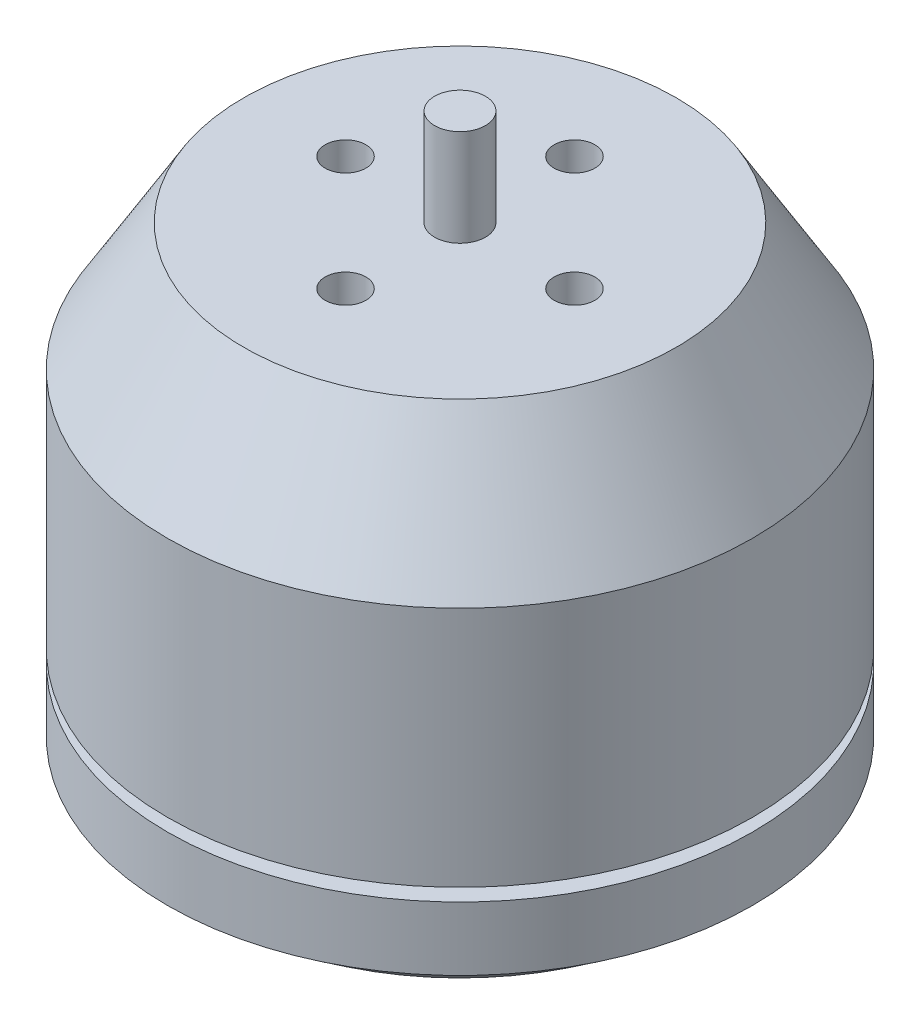
ISO-10303-21;
HEADER;
FILE_DESCRIPTION(('STEP AP214'),'2;1');
FILE_NAME('part.step','',(''),(''),'','','');
FILE_SCHEMA(('AUTOMOTIVE_DESIGN { 1 0 10303 214 1 1 1 1 }'));
ENDSEC;
DATA;
#1=APPLICATION_CONTEXT('core data for automotive mechanical design processes');
#2=APPLICATION_PROTOCOL_DEFINITION('international standard','automotive_design',2000,#1);
#3=PRODUCT_CONTEXT('',#1,'mechanical');
#4=PRODUCT('Part','Part','',(#3));
#5=PRODUCT_RELATED_PRODUCT_CATEGORY('part','',(#4));
#6=PRODUCT_DEFINITION_FORMATION('','',#4);
#7=PRODUCT_DEFINITION_CONTEXT('part definition',#1,'design');
#8=PRODUCT_DEFINITION('design','',#6,#7);
#9=PRODUCT_DEFINITION_SHAPE('','',#8);
#10=(LENGTH_UNIT() NAMED_UNIT(*) SI_UNIT(.MILLI.,.METRE.));
#11=(NAMED_UNIT(*) PLANE_ANGLE_UNIT() SI_UNIT($,.RADIAN.));
#12=(NAMED_UNIT(*) SI_UNIT($,.STERADIAN.) SOLID_ANGLE_UNIT());
#13=UNCERTAINTY_MEASURE_WITH_UNIT(LENGTH_MEASURE(1.E-05),#10,'distance_accuracy_value','');
#14=(GEOMETRIC_REPRESENTATION_CONTEXT(3) GLOBAL_UNCERTAINTY_ASSIGNED_CONTEXT((#13)) GLOBAL_UNIT_ASSIGNED_CONTEXT((#10,
#11,#12)) REPRESENTATION_CONTEXT('',''));
#15=CARTESIAN_POINT('',(0.,0.,0.));
#16=DIRECTION('',(0.,0.,1.));
#17=DIRECTION('',(1.,0.,0.));
#18=AXIS2_PLACEMENT_3D('',#15,#16,#17);
#19=CARTESIAN_POINT('',(1.,0.,0.));
#20=DIRECTION('',(0.,-1.,0.));
#21=DIRECTION('',(0.,0.,-1.));
#22=AXIS2_PLACEMENT_3D('',#19,#20,#21);
#23=PLANE('',#22);
#24=CARTESIAN_POINT('',(0.,0.,0.));
#25=DIRECTION('',(0.,-1.,0.));
#26=DIRECTION('',(0.,0.,-1.));
#27=AXIS2_PLACEMENT_3D('',#24,#25,#26);
#28=CIRCLE('',#27,1.);
#29=CARTESIAN_POINT('',(0.,0.,-1.));
#30=VERTEX_POINT('',#29);
#31=EDGE_CURVE('E11',#30,#30,#28,.T.);
#32=ORIENTED_EDGE('',*,*,#31,.T.);
#33=EDGE_LOOP('',(#32));
#34=FACE_BOUND('',#33,.T.);
#35=ADVANCED_FACE('F44',(#34),#23,.T.);
#36=CARTESIAN_POINT('',(0.,0.,0.));
#37=DIRECTION('',(0.,-1.,0.));
#38=DIRECTION('',(0.,0.,-1.));
#39=AXIS2_PLACEMENT_3D('',#36,#37,#38);
#40=CYLINDRICAL_SURFACE('',#39,1.);
#41=CARTESIAN_POINT('',(0.,1.3,0.));
#42=DIRECTION('',(0.,-1.,0.));
#43=DIRECTION('',(0.,0.,-1.));
#44=AXIS2_PLACEMENT_3D('',#41,#42,#43);
#45=CIRCLE('',#44,1.);
#46=CARTESIAN_POINT('',(0.,1.3,-1.));
#47=VERTEX_POINT('',#46);
#48=EDGE_CURVE('E52',#47,#47,#45,.T.);
#49=ORIENTED_EDGE('',*,*,#48,.T.);
#50=EDGE_LOOP('',(#49));
#51=FACE_BOUND('',#50,.T.);
#52=ORIENTED_EDGE('',*,*,#31,.F.);
#53=EDGE_LOOP('',(#52));
#54=FACE_BOUND('',#53,.T.);
#55=ADVANCED_FACE('F195',(#51,#54),#40,.T.);
#56=CARTESIAN_POINT('',(3.,1.3,0.));
#57=DIRECTION('',(0.,-1.,0.));
#58=DIRECTION('',(0.,0.,-1.));
#59=AXIS2_PLACEMENT_3D('',#56,#57,#58);
#60=PLANE('',#59);
#61=CARTESIAN_POINT('',(0.,1.3,0.));
#62=DIRECTION('',(0.,-1.,0.));
#63=DIRECTION('',(0.,0.,-1.));
#64=AXIS2_PLACEMENT_3D('',#61,#62,#63);
#65=CIRCLE('',#64,3.);
#66=CARTESIAN_POINT('',(0.,1.3,-3.));
#67=VERTEX_POINT('',#66);
#68=EDGE_CURVE('E189',#67,#67,#65,.T.);
#69=ORIENTED_EDGE('',*,*,#68,.T.);
#70=EDGE_LOOP('',(#69));
#71=FACE_BOUND('',#70,.T.);
#72=ORIENTED_EDGE('',*,*,#48,.F.);
#73=EDGE_LOOP('',(#72));
#74=FACE_BOUND('',#73,.T.);
#75=ADVANCED_FACE('F198',(#71,#74),#60,.T.);
#76=CARTESIAN_POINT('',(0.,0.,0.));
#77=DIRECTION('',(0.,-1.,0.));
#78=DIRECTION('',(0.,0.,-1.));
#79=AXIS2_PLACEMENT_3D('',#76,#77,#78);
#80=CYLINDRICAL_SURFACE('',#79,3.);
#81=CARTESIAN_POINT('',(0.,1.,0.));
#82=DIRECTION('',(0.,-1.,0.));
#83=DIRECTION('',(0.,0.,-1.));
#84=AXIS2_PLACEMENT_3D('',#81,#82,#83);
#85=CIRCLE('',#84,3.);
#86=CARTESIAN_POINT('',(0.,1.,-3.));
#87=VERTEX_POINT('',#86);
#88=EDGE_CURVE('E185',#87,#87,#85,.T.);
#89=ORIENTED_EDGE('',*,*,#88,.T.);
#90=EDGE_LOOP('',(#89));
#91=FACE_BOUND('',#90,.T.);
#92=ORIENTED_EDGE('',*,*,#68,.F.);
#93=EDGE_LOOP('',(#92));
#94=FACE_BOUND('',#93,.T.);
#95=ADVANCED_FACE('F200',(#91,#94),#80,.F.);
#96=CARTESIAN_POINT('',(9.5,1.,0.));
#97=DIRECTION('',(0.,-1.,0.));
#98=DIRECTION('',(0.,0.,-1.));
#99=AXIS2_PLACEMENT_3D('',#96,#97,#98);
#100=PLANE('',#99);
#101=CARTESIAN_POINT('',(0.,0.999999999999999,-8.));
#102=DIRECTION('',(0.,-1.,0.));
#103=DIRECTION('',(0.,0.,-1.));
#104=AXIS2_PLACEMENT_3D('',#101,#102,#103);
#105=CIRCLE('',#104,0.79999999999999);
#106=CARTESIAN_POINT('',(0.,0.999999999999999,-8.79999999999999));
#107=VERTEX_POINT('',#106);
#108=EDGE_CURVE('E93',#107,#107,#105,.T.);
#109=ORIENTED_EDGE('',*,*,#108,.F.);
#110=EDGE_LOOP('',(#109));
#111=FACE_BOUND('',#110,.T.);
#112=CARTESIAN_POINT('',(0.,0.999999999999999,8.));
#113=DIRECTION('',(0.,-1.,0.));
#114=DIRECTION('',(0.,0.,-1.));
#115=AXIS2_PLACEMENT_3D('',#112,#113,#114);
#116=CIRCLE('',#115,0.79999999999999);
#117=CARTESIAN_POINT('',(0.,0.999999999999999,7.20000000000001));
#118=VERTEX_POINT('',#117);
#119=EDGE_CURVE('E92',#118,#118,#116,.T.);
#120=ORIENTED_EDGE('',*,*,#119,.F.);
#121=EDGE_LOOP('',(#120));
#122=FACE_BOUND('',#121,.T.);
#123=CARTESIAN_POINT('',(-6.,0.999999999999999,0.));
#124=DIRECTION('',(0.,-1.,0.));
#125=DIRECTION('',(0.,0.,-1.));
#126=AXIS2_PLACEMENT_3D('',#123,#124,#125);
#127=CIRCLE('',#126,0.79999999999999);
#128=CARTESIAN_POINT('',(-6.,0.999999999999999,-0.79999999999999));
#129=VERTEX_POINT('',#128);
#130=EDGE_CURVE('E105',#129,#129,#127,.T.);
#131=ORIENTED_EDGE('',*,*,#130,.F.);
#132=EDGE_LOOP('',(#131));
#133=FACE_BOUND('',#132,.T.);
#134=CARTESIAN_POINT('',(6.,0.999999999999999,0.));
#135=DIRECTION('',(0.,-1.,0.));
#136=DIRECTION('',(0.,0.,-1.));
#137=AXIS2_PLACEMENT_3D('',#134,#135,#136);
#138=CIRCLE('',#137,0.79999999999999);
#139=CARTESIAN_POINT('',(6.,0.999999999999999,-0.79999999999999));
#140=VERTEX_POINT('',#139);
#141=EDGE_CURVE('E112',#140,#140,#138,.T.);
#142=ORIENTED_EDGE('',*,*,#141,.F.);
#143=EDGE_LOOP('',(#142));
#144=FACE_BOUND('',#143,.T.);
#145=CARTESIAN_POINT('',(0.,1.,0.));
#146=DIRECTION('',(0.,-1.,0.));
#147=DIRECTION('',(0.,0.,-1.));
#148=AXIS2_PLACEMENT_3D('',#145,#146,#147);
#149=CIRCLE('',#148,9.5);
#150=CARTESIAN_POINT('',(0.,1.,-9.5));
#151=VERTEX_POINT('',#150);
#152=EDGE_CURVE('E181',#151,#151,#149,.T.);
#153=ORIENTED_EDGE('',*,*,#152,.T.);
#154=EDGE_LOOP('',(#153));
#155=FACE_BOUND('',#154,.T.);
#156=ORIENTED_EDGE('',*,*,#88,.F.);
#157=EDGE_LOOP('',(#156));
#158=FACE_BOUND('',#157,.T.);
#159=ADVANCED_FACE('F207',(#111,#122,#133,#144,#155,#158),#100,.T.);
#160=CARTESIAN_POINT('',(0.,1.,0.));
#161=DIRECTION('',(0.,1.,0.));
#162=DIRECTION('',(0.,0.,1.));
#163=AXIS2_PLACEMENT_3D('',#160,#161,#162);
#164=CONICAL_SURFACE('',#163,9.5,0.927295218001613);
#165=CARTESIAN_POINT('',(0.,2.5,0.));
#166=DIRECTION('',(0.,-1.,0.));
#167=DIRECTION('',(0.,0.,-1.));
#168=AXIS2_PLACEMENT_3D('',#165,#166,#167);
#169=CIRCLE('',#168,11.5);
#170=CARTESIAN_POINT('',(0.,2.5,-11.5));
#171=VERTEX_POINT('',#170);
#172=EDGE_CURVE('E177',#171,#171,#169,.T.);
#173=ORIENTED_EDGE('',*,*,#172,.T.);
#174=EDGE_LOOP('',(#173));
#175=FACE_BOUND('',#174,.T.);
#176=ORIENTED_EDGE('',*,*,#152,.F.);
#177=EDGE_LOOP('',(#176));
#178=FACE_BOUND('',#177,.T.);
#179=ADVANCED_FACE('F236',(#175,#178),#164,.T.);
#180=CARTESIAN_POINT('',(0.,0.,0.));
#181=DIRECTION('',(0.,-1.,0.));
#182=DIRECTION('',(0.,0.,-1.));
#183=AXIS2_PLACEMENT_3D('',#180,#181,#182);
#184=CYLINDRICAL_SURFACE('',#183,11.5);
#185=CARTESIAN_POINT('',(0.,5.,0.));
#186=DIRECTION('',(0.,-1.,0.));
#187=DIRECTION('',(0.,0.,-1.));
#188=AXIS2_PLACEMENT_3D('',#185,#186,#187);
#189=CIRCLE('',#188,11.5);
#190=CARTESIAN_POINT('',(0.,5.,-11.5));
#191=VERTEX_POINT('',#190);
#192=EDGE_CURVE('E173',#191,#191,#189,.T.);
#193=ORIENTED_EDGE('',*,*,#192,.T.);
#194=EDGE_LOOP('',(#193));
#195=FACE_BOUND('',#194,.T.);
#196=ORIENTED_EDGE('',*,*,#172,.F.);
#197=EDGE_LOOP('',(#196));
#198=FACE_BOUND('',#197,.T.);
#199=ADVANCED_FACE('F242',(#195,#198),#184,.T.);
#200=CARTESIAN_POINT('',(11.5,5.,0.));
#201=DIRECTION('',(0.,1.,0.));
#202=DIRECTION('',(0.,0.,1.));
#203=AXIS2_PLACEMENT_3D('',#200,#201,#202);
#204=PLANE('',#203);
#205=CARTESIAN_POINT('',(0.,5.,0.));
#206=DIRECTION('',(0.,-1.,0.));
#207=DIRECTION('',(0.,0.,-1.));
#208=AXIS2_PLACEMENT_3D('',#205,#206,#207);
#209=CIRCLE('',#208,10.5);
#210=CARTESIAN_POINT('',(0.,5.,-10.5));
#211=VERTEX_POINT('',#210);
#212=EDGE_CURVE('E169',#211,#211,#209,.T.);
#213=ORIENTED_EDGE('',*,*,#212,.T.);
#214=EDGE_LOOP('',(#213));
#215=FACE_BOUND('',#214,.T.);
#216=ORIENTED_EDGE('',*,*,#192,.F.);
#217=EDGE_LOOP('',(#216));
#218=FACE_BOUND('',#217,.T.);
#219=ADVANCED_FACE('F253',(#215,#218),#204,.T.);
#220=CARTESIAN_POINT('',(0.,0.,0.));
#221=DIRECTION('',(0.,-1.,0.));
#222=DIRECTION('',(0.,0.,-1.));
#223=AXIS2_PLACEMENT_3D('',#220,#221,#222);
#224=CYLINDRICAL_SURFACE('',#223,10.5);
#225=CARTESIAN_POINT('',(0.,5.5,0.));
#226=DIRECTION('',(0.,-1.,0.));
#227=DIRECTION('',(0.,0.,-1.));
#228=AXIS2_PLACEMENT_3D('',#225,#226,#227);
#229=CIRCLE('',#228,10.5);
#230=CARTESIAN_POINT('',(0.,5.5,-10.5));
#231=VERTEX_POINT('',#230);
#232=EDGE_CURVE('E165',#231,#231,#229,.T.);
#233=ORIENTED_EDGE('',*,*,#232,.T.);
#234=EDGE_LOOP('',(#233));
#235=FACE_BOUND('',#234,.T.);
#236=ORIENTED_EDGE('',*,*,#212,.F.);
#237=EDGE_LOOP('',(#236));
#238=FACE_BOUND('',#237,.T.);
#239=ADVANCED_FACE('F264',(#235,#238),#224,.T.);
#240=CARTESIAN_POINT('',(10.5,5.5,0.));
#241=DIRECTION('',(0.,-1.,0.));
#242=DIRECTION('',(0.,0.,-1.));
#243=AXIS2_PLACEMENT_3D('',#240,#241,#242);
#244=PLANE('',#243);
#245=CARTESIAN_POINT('',(0.,5.5,0.));
#246=DIRECTION('',(0.,-1.,0.));
#247=DIRECTION('',(0.,0.,-1.));
#248=AXIS2_PLACEMENT_3D('',#245,#246,#247);
#249=CIRCLE('',#248,11.5);
#250=CARTESIAN_POINT('',(0.,5.5,-11.5));
#251=VERTEX_POINT('',#250);
#252=EDGE_CURVE('E161',#251,#251,#249,.T.);
#253=ORIENTED_EDGE('',*,*,#252,.T.);
#254=EDGE_LOOP('',(#253));
#255=FACE_BOUND('',#254,.T.);
#256=ORIENTED_EDGE('',*,*,#232,.F.);
#257=EDGE_LOOP('',(#256));
#258=FACE_BOUND('',#257,.T.);
#259=ADVANCED_FACE('F274',(#255,#258),#244,.T.);
#260=CARTESIAN_POINT('',(0.,0.,0.));
#261=DIRECTION('',(0.,-1.,0.));
#262=DIRECTION('',(0.,0.,-1.));
#263=AXIS2_PLACEMENT_3D('',#260,#261,#262);
#264=CYLINDRICAL_SURFACE('',#263,11.5);
#265=CARTESIAN_POINT('',(0.,15.,0.));
#266=DIRECTION('',(0.,-1.,0.));
#267=DIRECTION('',(0.,0.,-1.));
#268=AXIS2_PLACEMENT_3D('',#265,#266,#267);
#269=CIRCLE('',#268,11.5);
#270=CARTESIAN_POINT('',(0.,15.,-11.5));
#271=VERTEX_POINT('',#270);
#272=EDGE_CURVE('E157',#271,#271,#269,.T.);
#273=ORIENTED_EDGE('',*,*,#272,.T.);
#274=EDGE_LOOP('',(#273));
#275=FACE_BOUND('',#274,.T.);
#276=ORIENTED_EDGE('',*,*,#252,.F.);
#277=EDGE_LOOP('',(#276));
#278=FACE_BOUND('',#277,.T.);
#279=ADVANCED_FACE('F284',(#275,#278),#264,.T.);
#280=CARTESIAN_POINT('',(0.,15.,0.));
#281=DIRECTION('',(0.,-1.,0.));
#282=DIRECTION('',(0.,0.,-1.));
#283=AXIS2_PLACEMENT_3D('',#280,#281,#282);
#284=CONICAL_SURFACE('',#283,11.5,0.540419500270584);
#285=CARTESIAN_POINT('',(0.,20.,0.));
#286=DIRECTION('',(0.,-1.,0.));
#287=DIRECTION('',(0.,0.,-1.));
#288=AXIS2_PLACEMENT_3D('',#285,#286,#287);
#289=CIRCLE('',#288,8.5);
#290=CARTESIAN_POINT('',(0.,20.,-8.5));
#291=VERTEX_POINT('',#290);
#292=EDGE_CURVE('E153',#291,#291,#289,.T.);
#293=ORIENTED_EDGE('',*,*,#292,.T.);
#294=EDGE_LOOP('',(#293));
#295=FACE_BOUND('',#294,.T.);
#296=ORIENTED_EDGE('',*,*,#272,.F.);
#297=EDGE_LOOP('',(#296));
#298=FACE_BOUND('',#297,.T.);
#299=ADVANCED_FACE('F295',(#295,#298),#284,.T.);
#300=CARTESIAN_POINT('',(8.5,20.,0.));
#301=DIRECTION('',(0.,1.,0.));
#302=DIRECTION('',(0.,0.,1.));
#303=AXIS2_PLACEMENT_3D('',#300,#301,#302);
#304=PLANE('',#303);
#305=CARTESIAN_POINT('',(-4.5,20.,0.));
#306=DIRECTION('',(0.,1.,0.));
#307=DIRECTION('',(0.,0.,1.));
#308=AXIS2_PLACEMENT_3D('',#305,#306,#307);
#309=CIRCLE('',#308,0.799999999999999);
#310=CARTESIAN_POINT('',(-4.5,20.,0.799999999999999));
#311=VERTEX_POINT('',#310);
#312=EDGE_CURVE('E119',#311,#311,#309,.T.);
#313=ORIENTED_EDGE('',*,*,#312,.F.);
#314=EDGE_LOOP('',(#313));
#315=FACE_BOUND('',#314,.T.);
#316=CARTESIAN_POINT('',(0.,20.,-4.5));
#317=DIRECTION('',(0.,1.,0.));
#318=DIRECTION('',(0.,0.,1.));
#319=AXIS2_PLACEMENT_3D('',#316,#317,#318);
#320=CIRCLE('',#319,0.799999999999999);
#321=CARTESIAN_POINT('',(0.,20.,-3.7));
#322=VERTEX_POINT('',#321);
#323=EDGE_CURVE('E125',#322,#322,#320,.T.);
#324=ORIENTED_EDGE('',*,*,#323,.F.);
#325=EDGE_LOOP('',(#324));
#326=FACE_BOUND('',#325,.T.);
#327=CARTESIAN_POINT('',(4.5,20.,0.));
#328=DIRECTION('',(0.,1.,0.));
#329=DIRECTION('',(0.,0.,1.));
#330=AXIS2_PLACEMENT_3D('',#327,#328,#329);
#331=CIRCLE('',#330,0.799999999999999);
#332=CARTESIAN_POINT('',(4.5,20.,0.8));
#333=VERTEX_POINT('',#332);
#334=EDGE_CURVE('E132',#333,#333,#331,.T.);
#335=ORIENTED_EDGE('',*,*,#334,.F.);
#336=EDGE_LOOP('',(#335));
#337=FACE_BOUND('',#336,.T.);
#338=CARTESIAN_POINT('',(0.,20.,4.5));
#339=DIRECTION('',(0.,1.,0.));
#340=DIRECTION('',(0.,0.,1.));
#341=AXIS2_PLACEMENT_3D('',#338,#339,#340);
#342=CIRCLE('',#341,0.799999999999999);
#343=CARTESIAN_POINT('',(0.,20.,5.3));
#344=VERTEX_POINT('',#343);
#345=EDGE_CURVE('E140',#344,#344,#342,.T.);
#346=ORIENTED_EDGE('',*,*,#345,.F.);
#347=EDGE_LOOP('',(#346));
#348=FACE_BOUND('',#347,.T.);
#349=CARTESIAN_POINT('',(0.,20.,0.));
#350=DIRECTION('',(0.,-1.,0.));
#351=DIRECTION('',(0.,0.,-1.));
#352=AXIS2_PLACEMENT_3D('',#349,#350,#351);
#353=CIRCLE('',#352,1.);
#354=CARTESIAN_POINT('',(0.,20.,-1.));
#355=VERTEX_POINT('',#354);
#356=EDGE_CURVE('E150',#355,#355,#353,.T.);
#357=ORIENTED_EDGE('',*,*,#356,.T.);
#358=EDGE_LOOP('',(#357));
#359=FACE_BOUND('',#358,.T.);
#360=ORIENTED_EDGE('',*,*,#292,.F.);
#361=EDGE_LOOP('',(#360));
#362=FACE_BOUND('',#361,.T.);
#363=ADVANCED_FACE('F304',(#315,#326,#337,#348,#359,#362),#304,.T.);
#364=CARTESIAN_POINT('',(0.,0.,0.));
#365=DIRECTION('',(0.,-1.,0.));
#366=DIRECTION('',(0.,0.,-1.));
#367=AXIS2_PLACEMENT_3D('',#364,#365,#366);
#368=CYLINDRICAL_SURFACE('',#367,1.);
#369=CARTESIAN_POINT('',(0.,23.8,0.));
#370=DIRECTION('',(0.,-1.,0.));
#371=DIRECTION('',(0.,0.,-1.));
#372=AXIS2_PLACEMENT_3D('',#369,#370,#371);
#373=CIRCLE('',#372,1.);
#374=CARTESIAN_POINT('',(0.,23.8,-1.));
#375=VERTEX_POINT('',#374);
#376=EDGE_CURVE('E146',#375,#375,#373,.T.);
#377=ORIENTED_EDGE('',*,*,#376,.T.);
#378=EDGE_LOOP('',(#377));
#379=FACE_BOUND('',#378,.T.);
#380=ORIENTED_EDGE('',*,*,#356,.F.);
#381=EDGE_LOOP('',(#380));
#382=FACE_BOUND('',#381,.T.);
#383=ADVANCED_FACE('F310',(#379,#382),#368,.T.);
#384=CARTESIAN_POINT('',(1.,23.8,0.));
#385=DIRECTION('',(0.,1.,0.));
#386=DIRECTION('',(0.,0.,1.));
#387=AXIS2_PLACEMENT_3D('',#384,#385,#386);
#388=PLANE('',#387);
#389=ORIENTED_EDGE('',*,*,#376,.F.);
#390=EDGE_LOOP('',(#389));
#391=FACE_BOUND('',#390,.T.);
#392=ADVANCED_FACE('F315',(#391),#388,.T.);
#393=CARTESIAN_POINT('',(0.,17.,4.5));
#394=DIRECTION('',(0.,1.,0.));
#395=DIRECTION('',(0.,0.,1.));
#396=AXIS2_PLACEMENT_3D('',#393,#394,#395);
#397=CONICAL_SURFACE('',#396,0.799999999999999,1.02974425867665);
#398=CARTESIAN_POINT('',(0.,16.519311504778,4.5));
#399=VERTEX_POINT('',#398);
#400=VERTEX_LOOP('',#399);
#401=FACE_BOUND('',#400,.T.);
#402=CARTESIAN_POINT('',(0.,17.,4.5));
#403=DIRECTION('',(0.,1.,0.));
#404=DIRECTION('',(0.,0.,1.));
#405=AXIS2_PLACEMENT_3D('',#402,#403,#404);
#406=CIRCLE('',#405,0.799999999999999);
#407=CARTESIAN_POINT('',(0.,17.,5.3));
#408=VERTEX_POINT('',#407);
#409=EDGE_CURVE('E143',#408,#408,#406,.T.);
#410=ORIENTED_EDGE('',*,*,#409,.T.);
#411=EDGE_LOOP('',(#410));
#412=FACE_BOUND('',#411,.T.);
#413=ADVANCED_FACE('F326',(#401,#412),#397,.F.);
#414=CARTESIAN_POINT('',(0.,20.,4.5));
#415=DIRECTION('',(0.,1.,0.));
#416=DIRECTION('',(0.,0.,1.));
#417=AXIS2_PLACEMENT_3D('',#414,#415,#416);
#418=CYLINDRICAL_SURFACE('',#417,0.799999999999999);
#419=ORIENTED_EDGE('',*,*,#409,.F.);
#420=EDGE_LOOP('',(#419));
#421=FACE_BOUND('',#420,.T.);
#422=ORIENTED_EDGE('',*,*,#345,.T.);
#423=EDGE_LOOP('',(#422));
#424=FACE_BOUND('',#423,.T.);
#425=ADVANCED_FACE('F342',(#421,#424),#418,.F.);
#426=CARTESIAN_POINT('',(4.5,17.,0.));
#427=DIRECTION('',(0.,1.,0.));
#428=DIRECTION('',(0.,0.,1.));
#429=AXIS2_PLACEMENT_3D('',#426,#427,#428);
#430=CONICAL_SURFACE('',#429,0.799999999999999,1.02974425867665);
#431=CARTESIAN_POINT('',(4.5,16.519311504778,0.));
#432=VERTEX_POINT('',#431);
#433=VERTEX_LOOP('',#432);
#434=FACE_BOUND('',#433,.T.);
#435=CARTESIAN_POINT('',(4.5,17.,0.));
#436=DIRECTION('',(0.,1.,0.));
#437=DIRECTION('',(0.,0.,1.));
#438=AXIS2_PLACEMENT_3D('',#435,#436,#437);
#439=CIRCLE('',#438,0.799999999999999);
#440=CARTESIAN_POINT('',(4.5,17.,0.799999999999999));
#441=VERTEX_POINT('',#440);
#442=EDGE_CURVE('E136',#441,#441,#439,.T.);
#443=ORIENTED_EDGE('',*,*,#442,.T.);
#444=EDGE_LOOP('',(#443));
#445=FACE_BOUND('',#444,.T.);
#446=ADVANCED_FACE('F352',(#434,#445),#430,.F.);
#447=CARTESIAN_POINT('',(4.5,20.,0.));
#448=DIRECTION('',(0.,1.,0.));
#449=DIRECTION('',(0.,0.,1.));
#450=AXIS2_PLACEMENT_3D('',#447,#448,#449);
#451=CYLINDRICAL_SURFACE('',#450,0.799999999999999);
#452=ORIENTED_EDGE('',*,*,#442,.F.);
#453=EDGE_LOOP('',(#452));
#454=FACE_BOUND('',#453,.T.);
#455=ORIENTED_EDGE('',*,*,#334,.T.);
#456=EDGE_LOOP('',(#455));
#457=FACE_BOUND('',#456,.T.);
#458=ADVANCED_FACE('F364',(#454,#457),#451,.F.);
#459=CARTESIAN_POINT('',(0.,17.,-4.5));
#460=DIRECTION('',(0.,1.,0.));
#461=DIRECTION('',(0.,0.,1.));
#462=AXIS2_PLACEMENT_3D('',#459,#460,#461);
#463=CONICAL_SURFACE('',#462,0.799999999999999,1.02974425867665);
#464=CARTESIAN_POINT('',(0.,16.519311504778,-4.5));
#465=VERTEX_POINT('',#464);
#466=VERTEX_LOOP('',#465);
#467=FACE_BOUND('',#466,.T.);
#468=CARTESIAN_POINT('',(0.,17.,-4.5));
#469=DIRECTION('',(0.,1.,0.));
#470=DIRECTION('',(0.,0.,1.));
#471=AXIS2_PLACEMENT_3D('',#468,#469,#470);
#472=CIRCLE('',#471,0.799999999999999);
#473=CARTESIAN_POINT('',(0.,17.,-3.7));
#474=VERTEX_POINT('',#473);
#475=EDGE_CURVE('E129',#474,#474,#472,.T.);
#476=ORIENTED_EDGE('',*,*,#475,.T.);
#477=EDGE_LOOP('',(#476));
#478=FACE_BOUND('',#477,.T.);
#479=ADVANCED_FACE('F373',(#467,#478),#463,.F.);
#480=CARTESIAN_POINT('',(0.,20.,-4.5));
#481=DIRECTION('',(0.,1.,0.));
#482=DIRECTION('',(0.,0.,1.));
#483=AXIS2_PLACEMENT_3D('',#480,#481,#482);
#484=CYLINDRICAL_SURFACE('',#483,0.799999999999999);
#485=ORIENTED_EDGE('',*,*,#475,.F.);
#486=EDGE_LOOP('',(#485));
#487=FACE_BOUND('',#486,.T.);
#488=ORIENTED_EDGE('',*,*,#323,.T.);
#489=EDGE_LOOP('',(#488));
#490=FACE_BOUND('',#489,.T.);
#491=ADVANCED_FACE('F384',(#487,#490),#484,.F.);
#492=CARTESIAN_POINT('',(-4.5,17.,0.));
#493=DIRECTION('',(0.,1.,0.));
#494=DIRECTION('',(0.,0.,1.));
#495=AXIS2_PLACEMENT_3D('',#492,#493,#494);
#496=CONICAL_SURFACE('',#495,0.799999999999999,1.02974425867665);
#497=CARTESIAN_POINT('',(-4.5,16.519311504778,0.));
#498=VERTEX_POINT('',#497);
#499=VERTEX_LOOP('',#498);
#500=FACE_BOUND('',#499,.T.);
#501=CARTESIAN_POINT('',(-4.5,17.,0.));
#502=DIRECTION('',(0.,1.,0.));
#503=DIRECTION('',(0.,0.,1.));
#504=AXIS2_PLACEMENT_3D('',#501,#502,#503);
#505=CIRCLE('',#504,0.799999999999999);
#506=CARTESIAN_POINT('',(-4.5,17.,0.799999999999998));
#507=VERTEX_POINT('',#506);
#508=EDGE_CURVE('E122',#507,#507,#505,.T.);
#509=ORIENTED_EDGE('',*,*,#508,.T.);
#510=EDGE_LOOP('',(#509));
#511=FACE_BOUND('',#510,.T.);
#512=ADVANCED_FACE('F394',(#500,#511),#496,.F.);
#513=CARTESIAN_POINT('',(-4.5,20.,0.));
#514=DIRECTION('',(0.,1.,0.));
#515=DIRECTION('',(0.,0.,1.));
#516=AXIS2_PLACEMENT_3D('',#513,#514,#515);
#517=CYLINDRICAL_SURFACE('',#516,0.799999999999999);
#518=ORIENTED_EDGE('',*,*,#508,.F.);
#519=EDGE_LOOP('',(#518));
#520=FACE_BOUND('',#519,.T.);
#521=ORIENTED_EDGE('',*,*,#312,.T.);
#522=EDGE_LOOP('',(#521));
#523=FACE_BOUND('',#522,.T.);
#524=ADVANCED_FACE('F405',(#520,#523),#517,.F.);
#525=CARTESIAN_POINT('',(6.,6.,0.));
#526=DIRECTION('',(0.,-1.,0.));
#527=DIRECTION('',(0.,0.,-1.));
#528=AXIS2_PLACEMENT_3D('',#525,#526,#527);
#529=CONICAL_SURFACE('',#528,0.799999999999999,1.02974425867665);
#530=CARTESIAN_POINT('',(6.,6.48068849522205,0.));
#531=VERTEX_POINT('',#530);
#532=VERTEX_LOOP('',#531);
#533=FACE_BOUND('',#532,.T.);
#534=CARTESIAN_POINT('',(6.,6.,0.));
#535=DIRECTION('',(0.,-1.,0.));
#536=DIRECTION('',(0.,0.,-1.));
#537=AXIS2_PLACEMENT_3D('',#534,#535,#536);
#538=CIRCLE('',#537,0.799999999999999);
#539=CARTESIAN_POINT('',(6.,6.,-0.799999999999999));
#540=VERTEX_POINT('',#539);
#541=EDGE_CURVE('E116',#540,#540,#538,.T.);
#542=ORIENTED_EDGE('',*,*,#541,.T.);
#543=EDGE_LOOP('',(#542));
#544=FACE_BOUND('',#543,.T.);
#545=ADVANCED_FACE('F415',(#533,#544),#529,.F.);
#546=CARTESIAN_POINT('',(6.,1.,0.));
#547=DIRECTION('',(0.,-1.,0.));
#548=DIRECTION('',(0.,0.,-1.));
#549=AXIS2_PLACEMENT_3D('',#546,#547,#548);
#550=CYLINDRICAL_SURFACE('',#549,0.799999999999994);
#551=ORIENTED_EDGE('',*,*,#541,.F.);
#552=EDGE_LOOP('',(#551));
#553=FACE_BOUND('',#552,.T.);
#554=ORIENTED_EDGE('',*,*,#141,.T.);
#555=EDGE_LOOP('',(#554));
#556=FACE_BOUND('',#555,.T.);
#557=ADVANCED_FACE('F431',(#553,#556),#550,.F.);
#558=CARTESIAN_POINT('',(-6.,6.,0.));
#559=DIRECTION('',(0.,-1.,0.));
#560=DIRECTION('',(0.,0.,-1.));
#561=AXIS2_PLACEMENT_3D('',#558,#559,#560);
#562=CONICAL_SURFACE('',#561,0.799999999999999,1.02974425867665);
#563=CARTESIAN_POINT('',(-6.,6.48068849522205,0.));
#564=VERTEX_POINT('',#563);
#565=VERTEX_LOOP('',#564);
#566=FACE_BOUND('',#565,.T.);
#567=CARTESIAN_POINT('',(-6.,6.,0.));
#568=DIRECTION('',(0.,-1.,0.));
#569=DIRECTION('',(0.,0.,-1.));
#570=AXIS2_PLACEMENT_3D('',#567,#568,#569);
#571=CIRCLE('',#570,0.799999999999999);
#572=CARTESIAN_POINT('',(-6.,6.,-0.799999999999999));
#573=VERTEX_POINT('',#572);
#574=EDGE_CURVE('E109',#573,#573,#571,.T.);
#575=ORIENTED_EDGE('',*,*,#574,.T.);
#576=EDGE_LOOP('',(#575));
#577=FACE_BOUND('',#576,.T.);
#578=ADVANCED_FACE('F442',(#566,#577),#562,.F.);
#579=CARTESIAN_POINT('',(-6.,1.,0.));
#580=DIRECTION('',(0.,-1.,0.));
#581=DIRECTION('',(0.,0.,-1.));
#582=AXIS2_PLACEMENT_3D('',#579,#580,#581);
#583=CYLINDRICAL_SURFACE('',#582,0.799999999999994);
#584=ORIENTED_EDGE('',*,*,#574,.F.);
#585=EDGE_LOOP('',(#584));
#586=FACE_BOUND('',#585,.T.);
#587=ORIENTED_EDGE('',*,*,#130,.T.);
#588=EDGE_LOOP('',(#587));
#589=FACE_BOUND('',#588,.T.);
#590=ADVANCED_FACE('F454',(#586,#589),#583,.F.);
#591=CARTESIAN_POINT('',(0.,6.,8.));
#592=DIRECTION('',(0.,-1.,0.));
#593=DIRECTION('',(0.,0.,-1.));
#594=AXIS2_PLACEMENT_3D('',#591,#592,#593);
#595=CONICAL_SURFACE('',#594,0.799999999999999,1.02974425867665);
#596=CARTESIAN_POINT('',(0.,6.48068849522205,8.));
#597=VERTEX_POINT('',#596);
#598=VERTEX_LOOP('',#597);
#599=FACE_BOUND('',#598,.T.);
#600=CARTESIAN_POINT('',(0.,6.,8.));
#601=DIRECTION('',(0.,-1.,0.));
#602=DIRECTION('',(0.,0.,-1.));
#603=AXIS2_PLACEMENT_3D('',#600,#601,#602);
#604=CIRCLE('',#603,0.799999999999999);
#605=CARTESIAN_POINT('',(0.,6.,7.2));
#606=VERTEX_POINT('',#605);
#607=EDGE_CURVE('E98',#606,#606,#604,.T.);
#608=ORIENTED_EDGE('',*,*,#607,.T.);
#609=EDGE_LOOP('',(#608));
#610=FACE_BOUND('',#609,.T.);
#611=ADVANCED_FACE('F464',(#599,#610),#595,.F.);
#612=CARTESIAN_POINT('',(0.,1.,8.));
#613=DIRECTION('',(0.,-1.,0.));
#614=DIRECTION('',(0.,0.,-1.));
#615=AXIS2_PLACEMENT_3D('',#612,#613,#614);
#616=CYLINDRICAL_SURFACE('',#615,0.799999999999994);
#617=ORIENTED_EDGE('',*,*,#607,.F.);
#618=EDGE_LOOP('',(#617));
#619=FACE_BOUND('',#618,.T.);
#620=ORIENTED_EDGE('',*,*,#119,.T.);
#621=EDGE_LOOP('',(#620));
#622=FACE_BOUND('',#621,.T.);
#623=ADVANCED_FACE('F85',(#619,#622),#616,.F.);
#624=CARTESIAN_POINT('',(0.,6.,-8.));
#625=DIRECTION('',(0.,-1.,0.));
#626=DIRECTION('',(0.,0.,-1.));
#627=AXIS2_PLACEMENT_3D('',#624,#625,#626);
#628=CONICAL_SURFACE('',#627,0.799999999999999,1.02974425867665);
#629=CARTESIAN_POINT('',(0.,6.48068849522205,-8.));
#630=VERTEX_POINT('',#629);
#631=VERTEX_LOOP('',#630);
#632=FACE_BOUND('',#631,.T.);
#633=CARTESIAN_POINT('',(0.,6.,-8.));
#634=DIRECTION('',(0.,-1.,0.));
#635=DIRECTION('',(0.,0.,-1.));
#636=AXIS2_PLACEMENT_3D('',#633,#634,#635);
#637=CIRCLE('',#636,0.799999999999999);
#638=CARTESIAN_POINT('',(0.,6.,-8.8));
#639=VERTEX_POINT('',#638);
#640=EDGE_CURVE('E89',#639,#639,#637,.T.);
#641=ORIENTED_EDGE('',*,*,#640,.T.);
#642=EDGE_LOOP('',(#641));
#643=FACE_BOUND('',#642,.T.);
#644=ADVANCED_FACE('F81',(#632,#643),#628,.F.);
#645=CARTESIAN_POINT('',(0.,1.,-8.));
#646=DIRECTION('',(0.,-1.,0.));
#647=DIRECTION('',(0.,0.,-1.));
#648=AXIS2_PLACEMENT_3D('',#645,#646,#647);
#649=CYLINDRICAL_SURFACE('',#648,0.799999999999994);
#650=ORIENTED_EDGE('',*,*,#640,.F.);
#651=EDGE_LOOP('',(#650));
#652=FACE_BOUND('',#651,.T.);
#653=ORIENTED_EDGE('',*,*,#108,.T.);
#654=EDGE_LOOP('',(#653));
#655=FACE_BOUND('',#654,.T.);
#656=ADVANCED_FACE('F84',(#652,#655),#649,.F.);
#657=CLOSED_SHELL('',(#35,#55,#75,#95,#159,#179,#199,#219,#239,#259,#279,#299,#363,#383,#392,
#413,#425,#446,#458,#479,#491,#512,#524,#545,#557,#578,#590,#611,#623,#644,#656));
#658=MANIFOLD_SOLID_BREP('B2',#657);
#659=ADVANCED_BREP_SHAPE_REPRESENTATION('',(#18,#658),#14);
#660=SHAPE_DEFINITION_REPRESENTATION(#9,#659);
ENDSEC;
END-ISO-10303-21;
